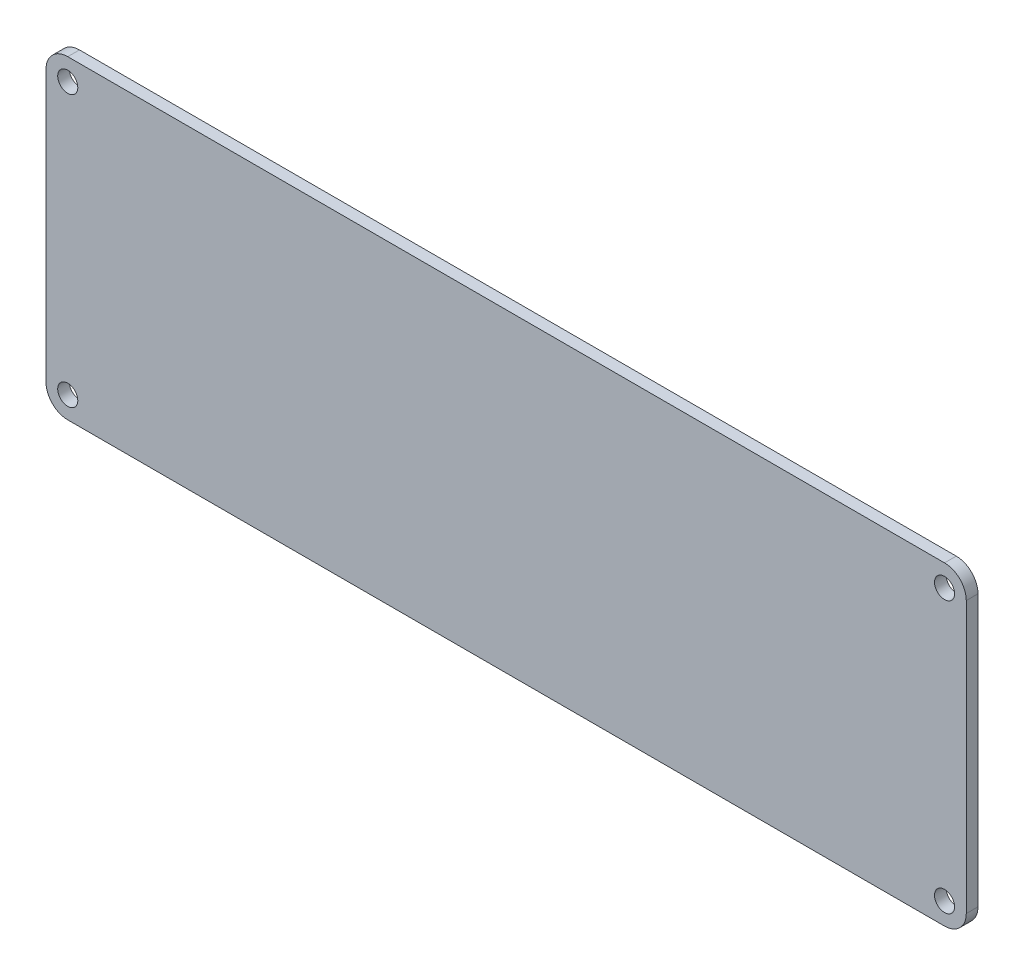
ISO-10303-21;
HEADER;
FILE_DESCRIPTION(('STEP AP214'),'2;1');
FILE_NAME('part.step','',(''),(''),'','','');
FILE_SCHEMA(('AUTOMOTIVE_DESIGN { 1 0 10303 214 1 1 1 1 }'));
ENDSEC;
DATA;
#1=APPLICATION_CONTEXT('core data for automotive mechanical design processes');
#2=APPLICATION_PROTOCOL_DEFINITION('international standard','automotive_design',2000,#1);
#3=PRODUCT_CONTEXT('',#1,'mechanical');
#4=PRODUCT('Part','Part','',(#3));
#5=PRODUCT_RELATED_PRODUCT_CATEGORY('part','',(#4));
#6=PRODUCT_DEFINITION_FORMATION('','',#4);
#7=PRODUCT_DEFINITION_CONTEXT('part definition',#1,'design');
#8=PRODUCT_DEFINITION('design','',#6,#7);
#9=PRODUCT_DEFINITION_SHAPE('','',#8);
#10=(LENGTH_UNIT() NAMED_UNIT(*) SI_UNIT(.MILLI.,.METRE.));
#11=(NAMED_UNIT(*) PLANE_ANGLE_UNIT() SI_UNIT($,.RADIAN.));
#12=(NAMED_UNIT(*) SI_UNIT($,.STERADIAN.) SOLID_ANGLE_UNIT());
#13=UNCERTAINTY_MEASURE_WITH_UNIT(LENGTH_MEASURE(1.E-05),#10,'distance_accuracy_value','');
#14=(GEOMETRIC_REPRESENTATION_CONTEXT(3) GLOBAL_UNCERTAINTY_ASSIGNED_CONTEXT((#13)) GLOBAL_UNIT_ASSIGNED_CONTEXT((#10,
#11,#12)) REPRESENTATION_CONTEXT('',''));
#15=CARTESIAN_POINT('',(0.,0.,0.));
#16=DIRECTION('',(0.,0.,1.));
#17=DIRECTION('',(1.,0.,0.));
#18=AXIS2_PLACEMENT_3D('',#15,#16,#17);
#19=CARTESIAN_POINT('',(3.302,44.45,1.778));
#20=DIRECTION('',(0.,0.,1.));
#21=DIRECTION('',(1.,0.,0.));
#22=AXIS2_PLACEMENT_3D('',#19,#20,#21);
#23=PLANE('',#22);
#24=CARTESIAN_POINT('',(136.398,3.302,1.778));
#25=DIRECTION('',(0.,0.,1.));
#26=DIRECTION('',(1.,0.,0.));
#27=AXIS2_PLACEMENT_3D('',#24,#25,#26);
#28=CIRCLE('',#27,1.52400000000001);
#29=CARTESIAN_POINT('',(137.922,3.302,1.778));
#30=VERTEX_POINT('',#29);
#31=EDGE_CURVE('E188',#30,#30,#28,.T.);
#32=ORIENTED_EDGE('',*,*,#31,.F.);
#33=EDGE_LOOP('',(#32));
#34=FACE_BOUND('',#33,.T.);
#35=CARTESIAN_POINT('',(3.302,44.45,1.778));
#36=DIRECTION('',(0.,0.,1.));
#37=DIRECTION('',(1.,0.,0.));
#38=AXIS2_PLACEMENT_3D('',#35,#36,#37);
#39=CIRCLE('',#38,1.524);
#40=CARTESIAN_POINT('',(4.826,44.45,1.778));
#41=VERTEX_POINT('',#40);
#42=EDGE_CURVE('E134',#41,#41,#39,.T.);
#43=ORIENTED_EDGE('',*,*,#42,.F.);
#44=EDGE_LOOP('',(#43));
#45=FACE_BOUND('',#44,.T.);
#46=CARTESIAN_POINT('',(3.302,44.45,1.778));
#47=DIRECTION('',(0.,0.,1.));
#48=DIRECTION('',(1.,0.,0.));
#49=AXIS2_PLACEMENT_3D('',#46,#47,#48);
#50=CIRCLE('',#49,3.302);
#51=CARTESIAN_POINT('',(3.30200000000002,47.752,1.778));
#52=VERTEX_POINT('',#51);
#53=CARTESIAN_POINT('',(0.,44.45,1.778));
#54=VERTEX_POINT('',#53);
#55=EDGE_CURVE('E145',#52,#54,#50,.T.);
#56=ORIENTED_EDGE('',*,*,#55,.T.);
#57=DIRECTION('',(0.,-1.,0.));
#58=VECTOR('',#57,1.);
#59=CARTESIAN_POINT('',(0.,3.30200000000002,1.778));
#60=LINE('',#59,#58);
#61=CARTESIAN_POINT('',(0.,3.30200000000002,1.778));
#62=VERTEX_POINT('',#61);
#63=EDGE_CURVE('E93',#54,#62,#60,.T.);
#64=ORIENTED_EDGE('',*,*,#63,.T.);
#65=CARTESIAN_POINT('',(3.302,3.302,1.778));
#66=DIRECTION('',(0.,0.,1.));
#67=DIRECTION('',(-1.,0.,0.));
#68=AXIS2_PLACEMENT_3D('',#65,#66,#67);
#69=CIRCLE('',#68,3.302);
#70=CARTESIAN_POINT('',(3.30200000000002,0.,1.778));
#71=VERTEX_POINT('',#70);
#72=EDGE_CURVE('E160',#62,#71,#69,.T.);
#73=ORIENTED_EDGE('',*,*,#72,.T.);
#74=DIRECTION('',(1.,0.,0.));
#75=VECTOR('',#74,1.);
#76=CARTESIAN_POINT('',(3.30200000000002,0.,1.778));
#77=LINE('',#76,#75);
#78=CARTESIAN_POINT('',(136.398,0.,1.778));
#79=VERTEX_POINT('',#78);
#80=EDGE_CURVE('E173',#71,#79,#77,.T.);
#81=ORIENTED_EDGE('',*,*,#80,.T.);
#82=CARTESIAN_POINT('',(136.398,3.302,1.778));
#83=DIRECTION('',(0.,0.,1.));
#84=DIRECTION('',(1.,0.,0.));
#85=AXIS2_PLACEMENT_3D('',#82,#83,#84);
#86=CIRCLE('',#85,3.302);
#87=CARTESIAN_POINT('',(139.7,3.30200000000002,1.778));
#88=VERTEX_POINT('',#87);
#89=EDGE_CURVE('E112',#79,#88,#86,.T.);
#90=ORIENTED_EDGE('',*,*,#89,.T.);
#91=DIRECTION('',(0.,1.,0.));
#92=VECTOR('',#91,1.);
#93=CARTESIAN_POINT('',(139.7,3.30200000000002,1.778));
#94=LINE('',#93,#92);
#95=CARTESIAN_POINT('',(139.7,44.45,1.778));
#96=VERTEX_POINT('',#95);
#97=EDGE_CURVE('E106',#88,#96,#94,.T.);
#98=ORIENTED_EDGE('',*,*,#97,.T.);
#99=CARTESIAN_POINT('',(136.398,44.45,1.778));
#100=DIRECTION('',(0.,0.,1.));
#101=DIRECTION('',(1.,0.,0.));
#102=AXIS2_PLACEMENT_3D('',#99,#100,#101);
#103=CIRCLE('',#102,3.302);
#104=CARTESIAN_POINT('',(136.398,47.752,1.778));
#105=VERTEX_POINT('',#104);
#106=EDGE_CURVE('E110',#96,#105,#103,.T.);
#107=ORIENTED_EDGE('',*,*,#106,.T.);
#108=DIRECTION('',(-1.,0.,0.));
#109=VECTOR('',#108,1.);
#110=CARTESIAN_POINT('',(3.30200000000002,47.752,1.778));
#111=LINE('',#110,#109);
#112=EDGE_CURVE('E50',#105,#52,#111,.T.);
#113=ORIENTED_EDGE('',*,*,#112,.T.);
#114=EDGE_LOOP('',(#56,#64,#73,#81,#90,#98,#107,#113));
#115=FACE_BOUND('',#114,.T.);
#116=CARTESIAN_POINT('',(136.398,44.45,1.778));
#117=DIRECTION('',(0.,0.,1.));
#118=DIRECTION('',(1.,0.,0.));
#119=AXIS2_PLACEMENT_3D('',#116,#117,#118);
#120=CIRCLE('',#119,1.52400000000001);
#121=CARTESIAN_POINT('',(137.922,44.45,1.778));
#122=VERTEX_POINT('',#121);
#123=EDGE_CURVE('E182',#122,#122,#120,.T.);
#124=ORIENTED_EDGE('',*,*,#123,.F.);
#125=EDGE_LOOP('',(#124));
#126=FACE_BOUND('',#125,.T.);
#127=CARTESIAN_POINT('',(3.302,3.302,1.778));
#128=DIRECTION('',(0.,0.,1.));
#129=DIRECTION('',(1.,0.,0.));
#130=AXIS2_PLACEMENT_3D('',#127,#128,#129);
#131=CIRCLE('',#130,1.524);
#132=CARTESIAN_POINT('',(4.826,3.302,1.778));
#133=VERTEX_POINT('',#132);
#134=EDGE_CURVE('E194',#133,#133,#131,.T.);
#135=ORIENTED_EDGE('',*,*,#134,.F.);
#136=EDGE_LOOP('',(#135));
#137=FACE_BOUND('',#136,.T.);
#138=ADVANCED_FACE('F33',(#34,#45,#115,#126,#137),#23,.T.);
#139=CARTESIAN_POINT('',(3.302,44.45,0.));
#140=DIRECTION('',(0.,0.,1.));
#141=DIRECTION('',(1.,0.,0.));
#142=AXIS2_PLACEMENT_3D('',#139,#140,#141);
#143=PLANE('',#142);
#144=CARTESIAN_POINT('',(136.398,3.302,0.));
#145=DIRECTION('',(0.,0.,1.));
#146=DIRECTION('',(1.,0.,0.));
#147=AXIS2_PLACEMENT_3D('',#144,#145,#146);
#148=CIRCLE('',#147,1.52400000000001);
#149=CARTESIAN_POINT('',(137.922,3.302,0.));
#150=VERTEX_POINT('',#149);
#151=EDGE_CURVE('E191',#150,#150,#148,.T.);
#152=ORIENTED_EDGE('',*,*,#151,.T.);
#153=EDGE_LOOP('',(#152));
#154=FACE_BOUND('',#153,.T.);
#155=CARTESIAN_POINT('',(3.302,44.45,0.));
#156=DIRECTION('',(0.,0.,1.));
#157=DIRECTION('',(1.,0.,0.));
#158=AXIS2_PLACEMENT_3D('',#155,#156,#157);
#159=CIRCLE('',#158,1.524);
#160=CARTESIAN_POINT('',(4.826,44.45,0.));
#161=VERTEX_POINT('',#160);
#162=EDGE_CURVE('E179',#161,#161,#159,.T.);
#163=ORIENTED_EDGE('',*,*,#162,.T.);
#164=EDGE_LOOP('',(#163));
#165=FACE_BOUND('',#164,.T.);
#166=CARTESIAN_POINT('',(3.302,44.45,0.));
#167=DIRECTION('',(0.,0.,1.));
#168=DIRECTION('',(1.,0.,0.));
#169=AXIS2_PLACEMENT_3D('',#166,#167,#168);
#170=CIRCLE('',#169,3.302);
#171=CARTESIAN_POINT('',(3.30200000000002,47.752,0.));
#172=VERTEX_POINT('',#171);
#173=CARTESIAN_POINT('',(0.,44.45,0.));
#174=VERTEX_POINT('',#173);
#175=EDGE_CURVE('E130',#172,#174,#170,.T.);
#176=ORIENTED_EDGE('',*,*,#175,.F.);
#177=DIRECTION('',(-1.,0.,0.));
#178=VECTOR('',#177,1.);
#179=CARTESIAN_POINT('',(3.30200000000002,47.752,0.));
#180=LINE('',#179,#178);
#181=CARTESIAN_POINT('',(136.398,47.752,0.));
#182=VERTEX_POINT('',#181);
#183=EDGE_CURVE('E85',#182,#172,#180,.T.);
#184=ORIENTED_EDGE('',*,*,#183,.F.);
#185=CARTESIAN_POINT('',(136.398,44.45,0.));
#186=DIRECTION('',(0.,0.,1.));
#187=DIRECTION('',(1.,0.,0.));
#188=AXIS2_PLACEMENT_3D('',#185,#186,#187);
#189=CIRCLE('',#188,3.302);
#190=CARTESIAN_POINT('',(139.7,44.45,0.));
#191=VERTEX_POINT('',#190);
#192=EDGE_CURVE('E79',#191,#182,#189,.T.);
#193=ORIENTED_EDGE('',*,*,#192,.F.);
#194=DIRECTION('',(0.,1.,0.));
#195=VECTOR('',#194,1.);
#196=CARTESIAN_POINT('',(139.7,3.30200000000002,0.));
#197=LINE('',#196,#195);
#198=CARTESIAN_POINT('',(139.7,3.30200000000002,0.));
#199=VERTEX_POINT('',#198);
#200=EDGE_CURVE('E120',#199,#191,#197,.T.);
#201=ORIENTED_EDGE('',*,*,#200,.F.);
#202=CARTESIAN_POINT('',(136.398,3.302,0.));
#203=DIRECTION('',(0.,0.,1.));
#204=DIRECTION('',(1.,0.,0.));
#205=AXIS2_PLACEMENT_3D('',#202,#203,#204);
#206=CIRCLE('',#205,3.302);
#207=CARTESIAN_POINT('',(136.398,0.,0.));
#208=VERTEX_POINT('',#207);
#209=EDGE_CURVE('E140',#208,#199,#206,.T.);
#210=ORIENTED_EDGE('',*,*,#209,.F.);
#211=DIRECTION('',(1.,0.,0.));
#212=VECTOR('',#211,1.);
#213=CARTESIAN_POINT('',(3.30200000000002,0.,0.));
#214=LINE('',#213,#212);
#215=CARTESIAN_POINT('',(3.30200000000002,0.,0.));
#216=VERTEX_POINT('',#215);
#217=EDGE_CURVE('E138',#216,#208,#214,.T.);
#218=ORIENTED_EDGE('',*,*,#217,.F.);
#219=CARTESIAN_POINT('',(3.302,3.302,0.));
#220=DIRECTION('',(0.,0.,1.));
#221=DIRECTION('',(-1.,0.,0.));
#222=AXIS2_PLACEMENT_3D('',#219,#220,#221);
#223=CIRCLE('',#222,3.302);
#224=CARTESIAN_POINT('',(0.,3.30200000000002,0.));
#225=VERTEX_POINT('',#224);
#226=EDGE_CURVE('E136',#225,#216,#223,.T.);
#227=ORIENTED_EDGE('',*,*,#226,.F.);
#228=DIRECTION('',(0.,-1.,0.));
#229=VECTOR('',#228,1.);
#230=CARTESIAN_POINT('',(0.,3.30200000000002,0.));
#231=LINE('',#230,#229);
#232=EDGE_CURVE('E133',#174,#225,#231,.T.);
#233=ORIENTED_EDGE('',*,*,#232,.F.);
#234=EDGE_LOOP('',(#176,#184,#193,#201,#210,#218,#227,#233));
#235=FACE_BOUND('',#234,.T.);
#236=CARTESIAN_POINT('',(136.398,44.45,0.));
#237=DIRECTION('',(0.,0.,1.));
#238=DIRECTION('',(1.,0.,0.));
#239=AXIS2_PLACEMENT_3D('',#236,#237,#238);
#240=CIRCLE('',#239,1.52400000000001);
#241=CARTESIAN_POINT('',(137.922,44.45,0.));
#242=VERTEX_POINT('',#241);
#243=EDGE_CURVE('E185',#242,#242,#240,.T.);
#244=ORIENTED_EDGE('',*,*,#243,.T.);
#245=EDGE_LOOP('',(#244));
#246=FACE_BOUND('',#245,.T.);
#247=CARTESIAN_POINT('',(3.302,3.302,0.));
#248=DIRECTION('',(0.,0.,1.));
#249=DIRECTION('',(1.,0.,0.));
#250=AXIS2_PLACEMENT_3D('',#247,#248,#249);
#251=CIRCLE('',#250,1.524);
#252=CARTESIAN_POINT('',(4.826,3.302,0.));
#253=VERTEX_POINT('',#252);
#254=EDGE_CURVE('E197',#253,#253,#251,.T.);
#255=ORIENTED_EDGE('',*,*,#254,.T.);
#256=EDGE_LOOP('',(#255));
#257=FACE_BOUND('',#256,.T.);
#258=ADVANCED_FACE('F164',(#154,#165,#235,#246,#257),#143,.F.);
#259=CARTESIAN_POINT('',(3.302,44.45,1.778));
#260=DIRECTION('',(0.,0.,-1.));
#261=DIRECTION('',(-1.,0.,0.));
#262=AXIS2_PLACEMENT_3D('',#259,#260,#261);
#263=CYLINDRICAL_SURFACE('',#262,3.302);
#264=ORIENTED_EDGE('',*,*,#175,.T.);
#265=DIRECTION('',(0.,0.,-1.));
#266=VECTOR('',#265,1.);
#267=CARTESIAN_POINT('',(0.,44.45,1.778));
#268=LINE('',#267,#266);
#269=EDGE_CURVE('E11',#54,#174,#268,.T.);
#270=ORIENTED_EDGE('',*,*,#269,.F.);
#271=ORIENTED_EDGE('',*,*,#55,.F.);
#272=DIRECTION('',(0.,0.,-1.));
#273=VECTOR('',#272,1.);
#274=CARTESIAN_POINT('',(3.30200000000002,47.752,1.778));
#275=LINE('',#274,#273);
#276=EDGE_CURVE('E126',#52,#172,#275,.T.);
#277=ORIENTED_EDGE('',*,*,#276,.T.);
#278=EDGE_LOOP('',(#264,#270,#271,#277));
#279=FACE_BOUND('',#278,.T.);
#280=ADVANCED_FACE('F35',(#279),#263,.T.);
#281=CARTESIAN_POINT('',(0.,3.30200000000002,1.778));
#282=DIRECTION('',(1.,0.,0.));
#283=DIRECTION('',(0.,0.,-1.));
#284=AXIS2_PLACEMENT_3D('',#281,#282,#283);
#285=PLANE('',#284);
#286=ORIENTED_EDGE('',*,*,#232,.T.);
#287=DIRECTION('',(0.,0.,-1.));
#288=VECTOR('',#287,1.);
#289=CARTESIAN_POINT('',(0.,3.30200000000002,1.778));
#290=LINE('',#289,#288);
#291=EDGE_CURVE('E42',#62,#225,#290,.T.);
#292=ORIENTED_EDGE('',*,*,#291,.F.);
#293=ORIENTED_EDGE('',*,*,#63,.F.);
#294=ORIENTED_EDGE('',*,*,#269,.T.);
#295=EDGE_LOOP('',(#286,#292,#293,#294));
#296=FACE_BOUND('',#295,.T.);
#297=ADVANCED_FACE('F232',(#296),#285,.F.);
#298=CARTESIAN_POINT('',(3.302,3.302,1.778));
#299=DIRECTION('',(0.,0.,-1.));
#300=DIRECTION('',(-1.,0.,0.));
#301=AXIS2_PLACEMENT_3D('',#298,#299,#300);
#302=CYLINDRICAL_SURFACE('',#301,3.302);
#303=ORIENTED_EDGE('',*,*,#226,.T.);
#304=DIRECTION('',(0.,0.,-1.));
#305=VECTOR('',#304,1.);
#306=CARTESIAN_POINT('',(3.30200000000002,0.,1.778));
#307=LINE('',#306,#305);
#308=EDGE_CURVE('E152',#71,#216,#307,.T.);
#309=ORIENTED_EDGE('',*,*,#308,.F.);
#310=ORIENTED_EDGE('',*,*,#72,.F.);
#311=ORIENTED_EDGE('',*,*,#291,.T.);
#312=EDGE_LOOP('',(#303,#309,#310,#311));
#313=FACE_BOUND('',#312,.T.);
#314=ADVANCED_FACE('F158',(#313),#302,.T.);
#315=CARTESIAN_POINT('',(3.30200000000002,0.,1.778));
#316=DIRECTION('',(0.,1.,0.));
#317=DIRECTION('',(0.,0.,1.));
#318=AXIS2_PLACEMENT_3D('',#315,#316,#317);
#319=PLANE('',#318);
#320=ORIENTED_EDGE('',*,*,#217,.T.);
#321=DIRECTION('',(0.,0.,-1.));
#322=VECTOR('',#321,1.);
#323=CARTESIAN_POINT('',(136.398,0.,1.778));
#324=LINE('',#323,#322);
#325=EDGE_CURVE('E149',#79,#208,#324,.T.);
#326=ORIENTED_EDGE('',*,*,#325,.F.);
#327=ORIENTED_EDGE('',*,*,#80,.F.);
#328=ORIENTED_EDGE('',*,*,#308,.T.);
#329=EDGE_LOOP('',(#320,#326,#327,#328));
#330=FACE_BOUND('',#329,.T.);
#331=ADVANCED_FACE('F169',(#330),#319,.F.);
#332=CARTESIAN_POINT('',(136.398,3.302,1.778));
#333=DIRECTION('',(0.,0.,-1.));
#334=DIRECTION('',(-1.,0.,0.));
#335=AXIS2_PLACEMENT_3D('',#332,#333,#334);
#336=CYLINDRICAL_SURFACE('',#335,3.302);
#337=ORIENTED_EDGE('',*,*,#209,.T.);
#338=DIRECTION('',(0.,0.,-1.));
#339=VECTOR('',#338,1.);
#340=CARTESIAN_POINT('',(139.7,3.30200000000002,1.778));
#341=LINE('',#340,#339);
#342=EDGE_CURVE('E121',#88,#199,#341,.T.);
#343=ORIENTED_EDGE('',*,*,#342,.F.);
#344=ORIENTED_EDGE('',*,*,#89,.F.);
#345=ORIENTED_EDGE('',*,*,#325,.T.);
#346=EDGE_LOOP('',(#337,#343,#344,#345));
#347=FACE_BOUND('',#346,.T.);
#348=ADVANCED_FACE('F172',(#347),#336,.T.);
#349=CARTESIAN_POINT('',(139.7,3.30200000000002,1.778));
#350=DIRECTION('',(-1.,0.,0.));
#351=DIRECTION('',(0.,0.,1.));
#352=AXIS2_PLACEMENT_3D('',#349,#350,#351);
#353=PLANE('',#352);
#354=ORIENTED_EDGE('',*,*,#200,.T.);
#355=DIRECTION('',(0.,0.,-1.));
#356=VECTOR('',#355,1.);
#357=CARTESIAN_POINT('',(139.7,44.45,1.778));
#358=LINE('',#357,#356);
#359=EDGE_CURVE('E117',#96,#191,#358,.T.);
#360=ORIENTED_EDGE('',*,*,#359,.F.);
#361=ORIENTED_EDGE('',*,*,#97,.F.);
#362=ORIENTED_EDGE('',*,*,#342,.T.);
#363=EDGE_LOOP('',(#354,#360,#361,#362));
#364=FACE_BOUND('',#363,.T.);
#365=ADVANCED_FACE('F118',(#364),#353,.F.);
#366=CARTESIAN_POINT('',(136.398,44.45,1.778));
#367=DIRECTION('',(0.,0.,-1.));
#368=DIRECTION('',(-1.,0.,0.));
#369=AXIS2_PLACEMENT_3D('',#366,#367,#368);
#370=CYLINDRICAL_SURFACE('',#369,3.302);
#371=ORIENTED_EDGE('',*,*,#192,.T.);
#372=DIRECTION('',(0.,0.,-1.));
#373=VECTOR('',#372,1.);
#374=CARTESIAN_POINT('',(136.398,47.752,1.778));
#375=LINE('',#374,#373);
#376=EDGE_CURVE('E122',#105,#182,#375,.T.);
#377=ORIENTED_EDGE('',*,*,#376,.F.);
#378=ORIENTED_EDGE('',*,*,#106,.F.);
#379=ORIENTED_EDGE('',*,*,#359,.T.);
#380=EDGE_LOOP('',(#371,#377,#378,#379));
#381=FACE_BOUND('',#380,.T.);
#382=ADVANCED_FACE('F124',(#381),#370,.T.);
#383=CARTESIAN_POINT('',(3.30200000000002,47.752,1.778));
#384=DIRECTION('',(0.,-1.,0.));
#385=DIRECTION('',(0.,0.,-1.));
#386=AXIS2_PLACEMENT_3D('',#383,#384,#385);
#387=PLANE('',#386);
#388=ORIENTED_EDGE('',*,*,#183,.T.);
#389=ORIENTED_EDGE('',*,*,#276,.F.);
#390=ORIENTED_EDGE('',*,*,#112,.F.);
#391=ORIENTED_EDGE('',*,*,#376,.T.);
#392=EDGE_LOOP('',(#388,#389,#390,#391));
#393=FACE_BOUND('',#392,.T.);
#394=ADVANCED_FACE('F220',(#393),#387,.F.);
#395=CARTESIAN_POINT('',(3.302,44.45,1.778));
#396=DIRECTION('',(0.,0.,-1.));
#397=DIRECTION('',(-1.,0.,0.));
#398=AXIS2_PLACEMENT_3D('',#395,#396,#397);
#399=CYLINDRICAL_SURFACE('',#398,1.524);
#400=ORIENTED_EDGE('',*,*,#42,.T.);
#401=EDGE_LOOP('',(#400));
#402=FACE_BOUND('',#401,.T.);
#403=ORIENTED_EDGE('',*,*,#162,.F.);
#404=EDGE_LOOP('',(#403));
#405=FACE_BOUND('',#404,.T.);
#406=ADVANCED_FACE('F217',(#402,#405),#399,.F.);
#407=CARTESIAN_POINT('',(136.398,44.45,1.778));
#408=DIRECTION('',(0.,0.,-1.));
#409=DIRECTION('',(-1.,0.,0.));
#410=AXIS2_PLACEMENT_3D('',#407,#408,#409);
#411=CYLINDRICAL_SURFACE('',#410,1.52400000000001);
#412=ORIENTED_EDGE('',*,*,#123,.T.);
#413=EDGE_LOOP('',(#412));
#414=FACE_BOUND('',#413,.T.);
#415=ORIENTED_EDGE('',*,*,#243,.F.);
#416=EDGE_LOOP('',(#415));
#417=FACE_BOUND('',#416,.T.);
#418=ADVANCED_FACE('F296',(#414,#417),#411,.F.);
#419=CARTESIAN_POINT('',(136.398,3.302,1.778));
#420=DIRECTION('',(0.,0.,-1.));
#421=DIRECTION('',(-1.,0.,0.));
#422=AXIS2_PLACEMENT_3D('',#419,#420,#421);
#423=CYLINDRICAL_SURFACE('',#422,1.52400000000001);
#424=ORIENTED_EDGE('',*,*,#31,.T.);
#425=EDGE_LOOP('',(#424));
#426=FACE_BOUND('',#425,.T.);
#427=ORIENTED_EDGE('',*,*,#151,.F.);
#428=EDGE_LOOP('',(#427));
#429=FACE_BOUND('',#428,.T.);
#430=ADVANCED_FACE('F304',(#426,#429),#423,.F.);
#431=CARTESIAN_POINT('',(3.302,3.302,1.778));
#432=DIRECTION('',(0.,0.,-1.));
#433=DIRECTION('',(-1.,0.,0.));
#434=AXIS2_PLACEMENT_3D('',#431,#432,#433);
#435=CYLINDRICAL_SURFACE('',#434,1.524);
#436=ORIENTED_EDGE('',*,*,#134,.T.);
#437=EDGE_LOOP('',(#436));
#438=FACE_BOUND('',#437,.T.);
#439=ORIENTED_EDGE('',*,*,#254,.F.);
#440=EDGE_LOOP('',(#439));
#441=FACE_BOUND('',#440,.T.);
#442=ADVANCED_FACE('F203',(#438,#441),#435,.F.);
#443=CLOSED_SHELL('',(#138,#258,#280,#297,#314,#331,#348,#365,#382,#394,#406,#418,#430,#442));
#444=MANIFOLD_SOLID_BREP('B2',#443);
#445=ADVANCED_BREP_SHAPE_REPRESENTATION('',(#18,#444),#14);
#446=SHAPE_DEFINITION_REPRESENTATION(#9,#445);
ENDSEC;
END-ISO-10303-21;
